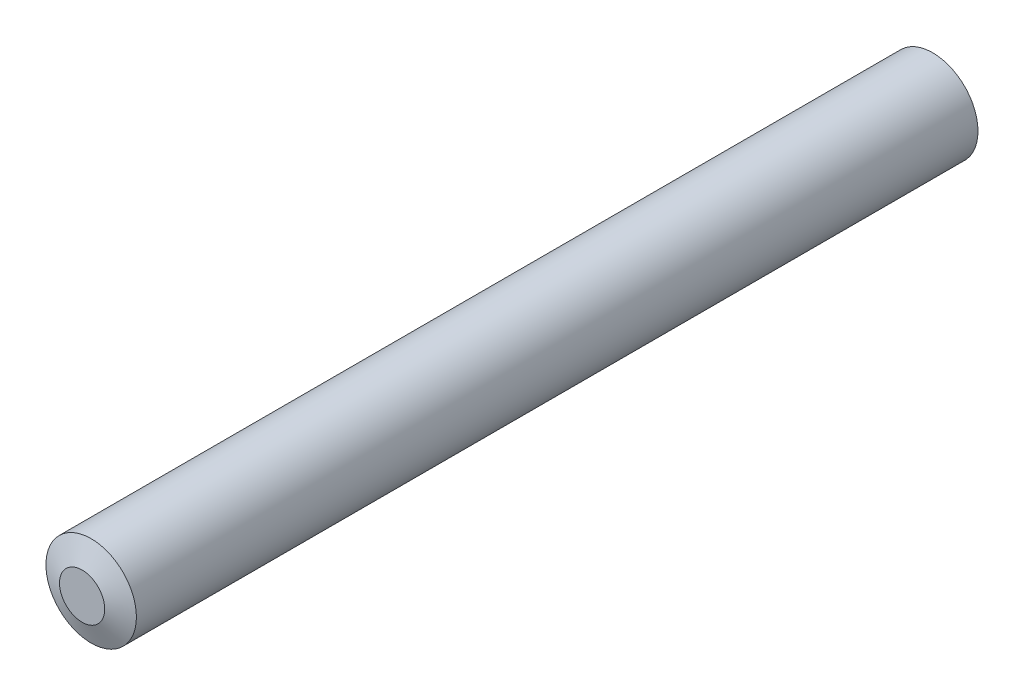
ISO-10303-21;
HEADER;
FILE_DESCRIPTION(('STEP AP214'),'2;1');
FILE_NAME('part.step','',(''),(''),'','','');
FILE_SCHEMA(('AUTOMOTIVE_DESIGN { 1 0 10303 214 1 1 1 1 }'));
ENDSEC;
DATA;
#1=APPLICATION_CONTEXT('core data for automotive mechanical design processes');
#2=APPLICATION_PROTOCOL_DEFINITION('international standard','automotive_design',2000,#1);
#3=PRODUCT_CONTEXT('',#1,'mechanical');
#4=PRODUCT('Part','Part','',(#3));
#5=PRODUCT_RELATED_PRODUCT_CATEGORY('part','',(#4));
#6=PRODUCT_DEFINITION_FORMATION('','',#4);
#7=PRODUCT_DEFINITION_CONTEXT('part definition',#1,'design');
#8=PRODUCT_DEFINITION('design','',#6,#7);
#9=PRODUCT_DEFINITION_SHAPE('','',#8);
#10=(LENGTH_UNIT() NAMED_UNIT(*) SI_UNIT(.MILLI.,.METRE.));
#11=(NAMED_UNIT(*) PLANE_ANGLE_UNIT() SI_UNIT($,.RADIAN.));
#12=(NAMED_UNIT(*) SI_UNIT($,.STERADIAN.) SOLID_ANGLE_UNIT());
#13=UNCERTAINTY_MEASURE_WITH_UNIT(LENGTH_MEASURE(1.E-05),#10,'distance_accuracy_value','');
#14=(GEOMETRIC_REPRESENTATION_CONTEXT(3) GLOBAL_UNCERTAINTY_ASSIGNED_CONTEXT((#13)) GLOBAL_UNIT_ASSIGNED_CONTEXT((#10,
#11,#12)) REPRESENTATION_CONTEXT('',''));
#15=CARTESIAN_POINT('',(0.,0.,0.));
#16=DIRECTION('',(0.,0.,1.));
#17=DIRECTION('',(1.,0.,0.));
#18=AXIS2_PLACEMENT_3D('',#15,#16,#17);
#19=CARTESIAN_POINT('',(0.,0.,19.));
#20=DIRECTION('',(0.,0.,-1.));
#21=DIRECTION('',(-1.,0.,0.));
#22=AXIS2_PLACEMENT_3D('',#19,#20,#21);
#23=CYLINDRICAL_SURFACE('',#22,2.);
#24=CARTESIAN_POINT('',(0.,0.,-18.6));
#25=DIRECTION('',(0.,0.,1.));
#26=DIRECTION('',(1.,0.,0.));
#27=AXIS2_PLACEMENT_3D('',#24,#25,#26);
#28=CIRCLE('',#27,2.);
#29=CARTESIAN_POINT('',(2.,0.,-18.6));
#30=VERTEX_POINT('',#29);
#31=EDGE_CURVE('E45',#30,#30,#28,.T.);
#32=ORIENTED_EDGE('',*,*,#31,.T.);
#33=EDGE_LOOP('',(#32));
#34=FACE_BOUND('',#33,.T.);
#35=CARTESIAN_POINT('',(0.,0.,18.6));
#36=DIRECTION('',(0.,0.,1.));
#37=DIRECTION('',(1.,0.,0.));
#38=AXIS2_PLACEMENT_3D('',#35,#36,#37);
#39=CIRCLE('',#38,2.);
#40=CARTESIAN_POINT('',(2.,0.,18.6));
#41=VERTEX_POINT('',#40);
#42=EDGE_CURVE('E51',#41,#41,#39,.F.);
#43=ORIENTED_EDGE('',*,*,#42,.T.);
#44=EDGE_LOOP('',(#43));
#45=FACE_BOUND('',#44,.T.);
#46=ADVANCED_FACE('F37',(#34,#45),#23,.T.);
#47=CARTESIAN_POINT('',(0.,0.,19.));
#48=DIRECTION('',(0.,0.,1.));
#49=DIRECTION('',(1.,0.,0.));
#50=AXIS2_PLACEMENT_3D('',#47,#48,#49);
#51=PLANE('',#50);
#52=CARTESIAN_POINT('',(0.,0.,19.));
#53=DIRECTION('',(0.,0.,1.));
#54=DIRECTION('',(1.,0.,0.));
#55=AXIS2_PLACEMENT_3D('',#52,#53,#54);
#56=CIRCLE('',#55,0.999999999999994);
#57=CARTESIAN_POINT('',(0.999999999999994,0.,19.));
#58=VERTEX_POINT('',#57);
#59=EDGE_CURVE('E55',#58,#58,#56,.T.);
#60=ORIENTED_EDGE('',*,*,#59,.T.);
#61=EDGE_LOOP('',(#60));
#62=FACE_BOUND('',#61,.T.);
#63=ADVANCED_FACE('F62',(#62),#51,.T.);
#64=CARTESIAN_POINT('',(0.,0.,-19.));
#65=DIRECTION('',(0.,0.,1.));
#66=DIRECTION('',(1.,0.,0.));
#67=AXIS2_PLACEMENT_3D('',#64,#65,#66);
#68=PLANE('',#67);
#69=CARTESIAN_POINT('',(0.,0.,-19.));
#70=DIRECTION('',(0.,0.,1.));
#71=DIRECTION('',(1.,0.,0.));
#72=AXIS2_PLACEMENT_3D('',#69,#70,#71);
#73=CIRCLE('',#72,0.999999999999987);
#74=CARTESIAN_POINT('',(0.999999999999987,0.,-19.));
#75=VERTEX_POINT('',#74);
#76=EDGE_CURVE('E10',#75,#75,#73,.F.);
#77=ORIENTED_EDGE('',*,*,#76,.T.);
#78=EDGE_LOOP('',(#77));
#79=FACE_BOUND('',#78,.T.);
#80=ADVANCED_FACE('F66',(#79),#68,.F.);
#81=CARTESIAN_POINT('',(0.,0.,19.));
#82=DIRECTION('',(0.,0.,-1.));
#83=DIRECTION('',(-1.,0.,0.));
#84=AXIS2_PLACEMENT_3D('',#81,#82,#83);
#85=CONICAL_SURFACE('',#84,0.999999999999994,1.19028994968253);
#86=ORIENTED_EDGE('',*,*,#42,.F.);
#87=EDGE_LOOP('',(#86));
#88=FACE_BOUND('',#87,.T.);
#89=ORIENTED_EDGE('',*,*,#59,.F.);
#90=EDGE_LOOP('',(#89));
#91=FACE_BOUND('',#90,.T.);
#92=ADVANCED_FACE('F64',(#88,#91),#85,.T.);
#93=CARTESIAN_POINT('',(0.,0.,-18.6));
#94=DIRECTION('',(0.,0.,1.));
#95=DIRECTION('',(1.,0.,0.));
#96=AXIS2_PLACEMENT_3D('',#93,#94,#95);
#97=CONICAL_SURFACE('',#96,2.,1.19028994968253);
#98=ORIENTED_EDGE('',*,*,#76,.F.);
#99=EDGE_LOOP('',(#98));
#100=FACE_BOUND('',#99,.T.);
#101=ORIENTED_EDGE('',*,*,#31,.F.);
#102=EDGE_LOOP('',(#101));
#103=FACE_BOUND('',#102,.T.);
#104=ADVANCED_FACE('F39',(#100,#103),#97,.T.);
#105=CLOSED_SHELL('',(#46,#63,#80,#92,#104));
#106=MANIFOLD_SOLID_BREP('B2',#105);
#107=ADVANCED_BREP_SHAPE_REPRESENTATION('',(#18,#106),#14);
#108=SHAPE_DEFINITION_REPRESENTATION(#9,#107);
ENDSEC;
END-ISO-10303-21;
